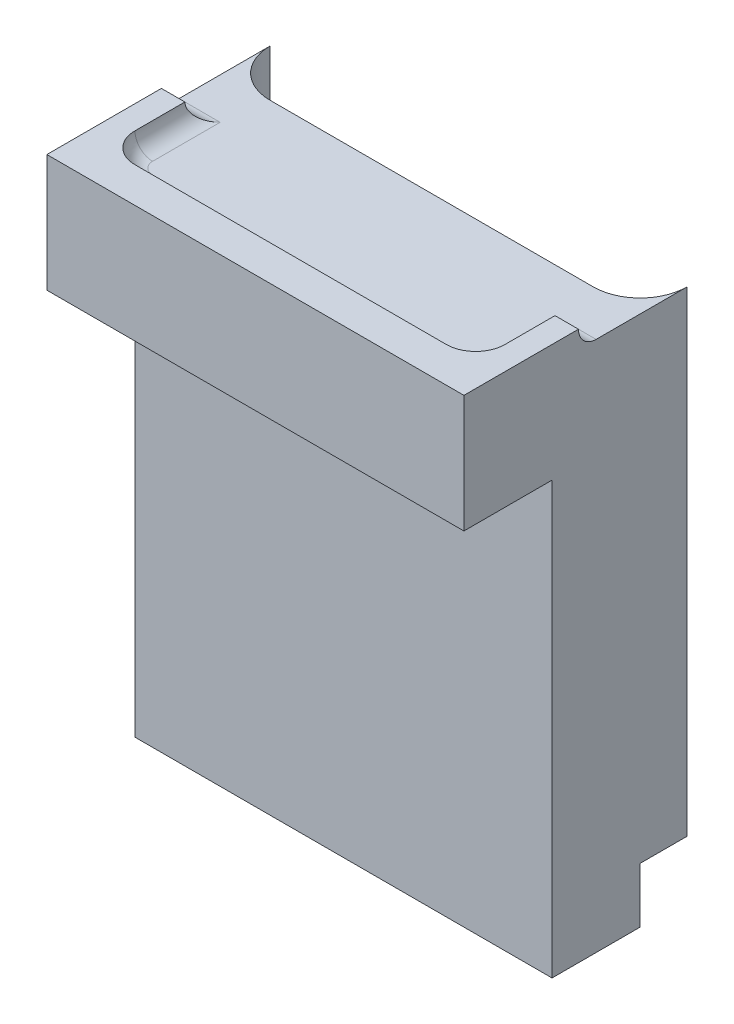
ISO-10303-21;
HEADER;
FILE_DESCRIPTION(('STEP AP214'),'2;1');
FILE_NAME('part.step','',(''),(''),'','','');
FILE_SCHEMA(('AUTOMOTIVE_DESIGN { 1 0 10303 214 1 1 1 1 }'));
ENDSEC;
DATA;
#1=APPLICATION_CONTEXT('core data for automotive mechanical design processes');
#2=APPLICATION_PROTOCOL_DEFINITION('international standard','automotive_design',2000,#1);
#3=PRODUCT_CONTEXT('',#1,'mechanical');
#4=PRODUCT('Part','Part','',(#3));
#5=PRODUCT_RELATED_PRODUCT_CATEGORY('part','',(#4));
#6=PRODUCT_DEFINITION_FORMATION('','',#4);
#7=PRODUCT_DEFINITION_CONTEXT('part definition',#1,'design');
#8=PRODUCT_DEFINITION('design','',#6,#7);
#9=PRODUCT_DEFINITION_SHAPE('','',#8);
#10=(LENGTH_UNIT() NAMED_UNIT(*) SI_UNIT(.MILLI.,.METRE.));
#11=(NAMED_UNIT(*) PLANE_ANGLE_UNIT() SI_UNIT($,.RADIAN.));
#12=(NAMED_UNIT(*) SI_UNIT($,.STERADIAN.) SOLID_ANGLE_UNIT());
#13=UNCERTAINTY_MEASURE_WITH_UNIT(LENGTH_MEASURE(1.E-05),#10,'distance_accuracy_value','');
#14=(GEOMETRIC_REPRESENTATION_CONTEXT(3) GLOBAL_UNCERTAINTY_ASSIGNED_CONTEXT((#13)) GLOBAL_UNIT_ASSIGNED_CONTEXT((#10,
#11,#12)) REPRESENTATION_CONTEXT('',''));
#15=CARTESIAN_POINT('',(0.,0.,0.));
#16=DIRECTION('',(0.,0.,1.));
#17=DIRECTION('',(1.,0.,0.));
#18=AXIS2_PLACEMENT_3D('',#15,#16,#17);
#19=CARTESIAN_POINT('',(-7.10000000000019,13.,4.45000000000175));
#20=DIRECTION('',(1.,0.,0.));
#21=DIRECTION('',(0.,0.,-1.));
#22=AXIS2_PLACEMENT_3D('',#19,#20,#21);
#23=PLANE('',#22);
#24=DIRECTION('',(0.,-1.,0.));
#25=VECTOR('',#24,1.);
#26=CARTESIAN_POINT('',(-7.10000000000019,25.7,9.60000000000174));
#27=LINE('',#26,#25);
#28=CARTESIAN_POINT('',(-7.10000000000019,4.6,9.60000000000174));
#29=VERTEX_POINT('',#28);
#30=CARTESIAN_POINT('',(-7.10000000000019,3.66,9.60000000000174));
#31=VERTEX_POINT('',#30);
#32=EDGE_CURVE('E182',#29,#31,#27,.T.);
#33=ORIENTED_EDGE('',*,*,#32,.T.);
#34=DIRECTION('',(0.,0.,-1.));
#35=VECTOR('',#34,1.);
#36=CARTESIAN_POINT('',(-7.10000000000019,3.66,0.));
#37=LINE('',#36,#35);
#38=CARTESIAN_POINT('',(-7.10000000000019,3.66,11.1000000000022));
#39=VERTEX_POINT('',#38);
#40=EDGE_CURVE('E217',#39,#31,#37,.T.);
#41=ORIENTED_EDGE('',*,*,#40,.F.);
#42=DIRECTION('',(0.,1.,0.));
#43=VECTOR('',#42,1.);
#44=CARTESIAN_POINT('',(-7.10000000000019,39.2564753917994,11.1000000000022));
#45=LINE('',#44,#43);
#46=CARTESIAN_POINT('',(-7.10000000000019,11.,11.1000000000022));
#47=VERTEX_POINT('',#46);
#48=EDGE_CURVE('E235',#39,#47,#45,.T.);
#49=ORIENTED_EDGE('',*,*,#48,.T.);
#50=DIRECTION('',(0.,0.,-1.));
#51=VECTOR('',#50,1.);
#52=CARTESIAN_POINT('',(-7.10000000000019,11.,0.));
#53=LINE('',#52,#51);
#54=CARTESIAN_POINT('',(-7.10000000000019,11.,12.6000000000022));
#55=VERTEX_POINT('',#54);
#56=EDGE_CURVE('E199',#55,#47,#53,.T.);
#57=ORIENTED_EDGE('',*,*,#56,.F.);
#58=DIRECTION('',(0.,-1.,0.));
#59=VECTOR('',#58,1.);
#60=CARTESIAN_POINT('',(-7.10000000000019,13.,12.6000000000022));
#61=LINE('',#60,#59);
#62=CARTESIAN_POINT('',(-7.10000000000019,13.,12.6000000000022));
#63=VERTEX_POINT('',#62);
#64=EDGE_CURVE('E212',#63,#55,#61,.T.);
#65=ORIENTED_EDGE('',*,*,#64,.F.);
#66=DIRECTION('',(0.,0.,-1.));
#67=VECTOR('',#66,1.);
#68=CARTESIAN_POINT('',(-7.10000000000019,13.,0.));
#69=LINE('',#68,#67);
#70=CARTESIAN_POINT('',(-7.10000000000019,13.,10.6500000000017));
#71=VERTEX_POINT('',#70);
#72=EDGE_CURVE('E224',#63,#71,#69,.T.);
#73=ORIENTED_EDGE('',*,*,#72,.T.);
#74=CARTESIAN_POINT('',(-7.10000000000019,13.,10.3500000000017));
#75=DIRECTION('',(1.,0.,0.));
#76=DIRECTION('',(0.,0.,-1.));
#77=AXIS2_PLACEMENT_3D('',#74,#75,#76);
#78=CIRCLE('',#77,0.3);
#79=CARTESIAN_POINT('',(-7.10000000000019,12.7,10.3500000000017));
#80=VERTEX_POINT('',#79);
#81=EDGE_CURVE('E178',#80,#71,#78,.F.);
#82=ORIENTED_EDGE('',*,*,#81,.F.);
#83=DIRECTION('',(0.,0.,-1.));
#84=VECTOR('',#83,1.);
#85=CARTESIAN_POINT('',(-7.10000000000019,12.7,4.45000000000179));
#86=LINE('',#85,#84);
#87=CARTESIAN_POINT('',(-7.09999999999805,12.7,8.80000000000174));
#88=VERTEX_POINT('',#87);
#89=EDGE_CURVE('E175',#80,#88,#86,.T.);
#90=ORIENTED_EDGE('',*,*,#89,.T.);
#91=DIRECTION('',(0.,-1.,0.));
#92=VECTOR('',#91,1.);
#93=CARTESIAN_POINT('',(-7.09999999999805,25.7,8.80000000000174));
#94=LINE('',#93,#92);
#95=CARTESIAN_POINT('',(-7.09999999999805,4.60000000000001,8.80000000000174));
#96=VERTEX_POINT('',#95);
#97=EDGE_CURVE('E167',#88,#96,#94,.T.);
#98=ORIENTED_EDGE('',*,*,#97,.T.);
#99=DIRECTION('',(0.,0.,1.));
#100=VECTOR('',#99,1.);
#101=CARTESIAN_POINT('',(-7.10000000000019,4.6,3.65000000000174));
#102=LINE('',#101,#100);
#103=EDGE_CURVE('E183',#96,#29,#102,.T.);
#104=ORIENTED_EDGE('',*,*,#103,.T.);
#105=EDGE_LOOP('',(#33,#41,#49,#57,#65,#73,#82,#90,#98,#104));
#106=FACE_BOUND('',#105,.T.);
#107=ADVANCED_FACE('F41',(#106),#23,.F.);
#108=CARTESIAN_POINT('',(1.95069654873592E-12,13.,4.45000000000175));
#109=DIRECTION('',(1.,0.,0.));
#110=DIRECTION('',(0.,0.,-1.));
#111=AXIS2_PLACEMENT_3D('',#108,#109,#110);
#112=PLANE('',#111);
#113=DIRECTION('',(0.,0.,1.));
#114=VECTOR('',#113,1.);
#115=CARTESIAN_POINT('',(1.95069654873592E-12,4.6,3.65000000000174));
#116=LINE('',#115,#114);
#117=CARTESIAN_POINT('',(1.95156391047391E-12,4.60000000000001,8.79999999999824));
#118=VERTEX_POINT('',#117);
#119=CARTESIAN_POINT('',(1.95102180938767E-12,4.6,9.59999999999824));
#120=VERTEX_POINT('',#119);
#121=EDGE_CURVE('E205',#118,#120,#116,.T.);
#122=ORIENTED_EDGE('',*,*,#121,.F.);
#123=DIRECTION('',(0.,-1.,0.));
#124=VECTOR('',#123,1.);
#125=CARTESIAN_POINT('',(1.95156391047391E-12,25.7,8.79999999999824));
#126=LINE('',#125,#124);
#127=CARTESIAN_POINT('',(1.95069654873592E-12,12.7,8.79999999999824));
#128=VERTEX_POINT('',#127);
#129=EDGE_CURVE('E196',#128,#118,#126,.T.);
#130=ORIENTED_EDGE('',*,*,#129,.F.);
#131=DIRECTION('',(0.,0.,-1.));
#132=VECTOR('',#131,1.);
#133=CARTESIAN_POINT('',(1.95069654873592E-12,12.7,4.45000000000179));
#134=LINE('',#133,#132);
#135=CARTESIAN_POINT('',(1.95129285993079E-12,12.7,10.3499999999982));
#136=VERTEX_POINT('',#135);
#137=EDGE_CURVE('E208',#136,#128,#134,.T.);
#138=ORIENTED_EDGE('',*,*,#137,.F.);
#139=CARTESIAN_POINT('',(1.9513199649851E-12,13.,10.3499999999982));
#140=DIRECTION('',(1.,0.,0.));
#141=DIRECTION('',(0.,0.,-1.));
#142=AXIS2_PLACEMENT_3D('',#139,#140,#141);
#143=CIRCLE('',#142,0.3);
#144=CARTESIAN_POINT('',(1.95129285993079E-12,13.,10.6499999999982));
#145=VERTEX_POINT('',#144);
#146=EDGE_CURVE('E232',#136,#145,#143,.F.);
#147=ORIENTED_EDGE('',*,*,#146,.T.);
#148=DIRECTION('',(0.,0.,-1.));
#149=VECTOR('',#148,1.);
#150=CARTESIAN_POINT('',(1.9502229585845E-12,13.,0.));
#151=LINE('',#150,#149);
#152=CARTESIAN_POINT('',(1.94982918699793E-12,13.,12.6000000000022));
#153=VERTEX_POINT('',#152);
#154=EDGE_CURVE('E214',#153,#145,#151,.T.);
#155=ORIENTED_EDGE('',*,*,#154,.F.);
#156=DIRECTION('',(0.,-1.,0.));
#157=VECTOR('',#156,1.);
#158=CARTESIAN_POINT('',(1.94982918699793E-12,13.,12.6000000000022));
#159=LINE('',#158,#157);
#160=CARTESIAN_POINT('',(1.95113022960491E-12,11.,12.6000000000022));
#161=VERTEX_POINT('',#160);
#162=EDGE_CURVE('E227',#153,#161,#159,.T.);
#163=ORIENTED_EDGE('',*,*,#162,.T.);
#164=DIRECTION('',(0.,0.,-1.));
#165=VECTOR('',#164,1.);
#166=CARTESIAN_POINT('',(1.9502229585845E-12,11.,0.));
#167=LINE('',#166,#165);
#168=CARTESIAN_POINT('',(1.95113022960491E-12,11.,11.1000000000022));
#169=VERTEX_POINT('',#168);
#170=EDGE_CURVE('E172',#161,#169,#167,.T.);
#171=ORIENTED_EDGE('',*,*,#170,.T.);
#172=DIRECTION('',(0.,1.,0.));
#173=VECTOR('',#172,1.);
#174=CARTESIAN_POINT('',(1.95156391047391E-12,39.2564753917994,11.1000000000022));
#175=LINE('',#174,#173);
#176=CARTESIAN_POINT('',(1.95156391047391E-12,3.66,11.1000000000022));
#177=VERTEX_POINT('',#176);
#178=EDGE_CURVE('E202',#177,#169,#175,.T.);
#179=ORIENTED_EDGE('',*,*,#178,.F.);
#180=DIRECTION('',(0.,0.,-1.));
#181=VECTOR('',#180,1.);
#182=CARTESIAN_POINT('',(1.9502229585845E-12,3.66,0.));
#183=LINE('',#182,#181);
#184=CARTESIAN_POINT('',(1.95156391047391E-12,3.66,9.59999999999824));
#185=VERTEX_POINT('',#184);
#186=EDGE_CURVE('E220',#177,#185,#183,.T.);
#187=ORIENTED_EDGE('',*,*,#186,.T.);
#188=DIRECTION('',(0.,-1.,0.));
#189=VECTOR('',#188,1.);
#190=CARTESIAN_POINT('',(1.95156391047391E-12,25.7,9.59999999999824));
#191=LINE('',#190,#189);
#192=EDGE_CURVE('E210',#120,#185,#191,.T.);
#193=ORIENTED_EDGE('',*,*,#192,.F.);
#194=EDGE_LOOP('',(#122,#130,#138,#147,#155,#163,#171,#179,#187,#193));
#195=FACE_BOUND('',#194,.T.);
#196=ADVANCED_FACE('F284',(#195),#112,.T.);
#197=CARTESIAN_POINT('',(0.,3.66,0.));
#198=DIRECTION('',(0.,1.,0.));
#199=DIRECTION('',(0.,0.,1.));
#200=AXIS2_PLACEMENT_3D('',#197,#198,#199);
#201=PLANE('',#200);
#202=DIRECTION('',(-1.,0.,0.));
#203=VECTOR('',#202,1.);
#204=CARTESIAN_POINT('',(2.45000000000471,3.66,11.1000000000022));
#205=LINE('',#204,#203);
#206=EDGE_CURVE('E49',#177,#39,#205,.T.);
#207=ORIENTED_EDGE('',*,*,#206,.T.);
#208=ORIENTED_EDGE('',*,*,#40,.T.);
#209=DIRECTION('',(1.,0.,-4.92999580553094E-13));
#210=VECTOR('',#209,1.);
#211=CARTESIAN_POINT('',(-6.29999999999765,3.66,9.60000000000135));
#212=LINE('',#211,#210);
#213=EDGE_CURVE('E260',#31,#185,#212,.T.);
#214=ORIENTED_EDGE('',*,*,#213,.T.);
#215=ORIENTED_EDGE('',*,*,#186,.F.);
#216=EDGE_LOOP('',(#207,#208,#214,#215));
#217=FACE_BOUND('',#216,.T.);
#218=ADVANCED_FACE('F269',(#217),#201,.F.);
#219=CARTESIAN_POINT('',(2.45000000000471,39.2564753917994,11.1000000000022));
#220=DIRECTION('',(0.,0.,1.));
#221=DIRECTION('',(1.,0.,0.));
#222=AXIS2_PLACEMENT_3D('',#219,#220,#221);
#223=PLANE('',#222);
#224=ORIENTED_EDGE('',*,*,#48,.F.);
#225=ORIENTED_EDGE('',*,*,#206,.F.);
#226=ORIENTED_EDGE('',*,*,#178,.T.);
#227=DIRECTION('',(-1.,0.,0.));
#228=VECTOR('',#227,1.);
#229=CARTESIAN_POINT('',(2.45000000000471,11.,11.1000000000022));
#230=LINE('',#229,#228);
#231=EDGE_CURVE('E263',#169,#47,#230,.T.);
#232=ORIENTED_EDGE('',*,*,#231,.T.);
#233=EDGE_LOOP('',(#224,#225,#226,#232));
#234=FACE_BOUND('',#233,.T.);
#235=ADVANCED_FACE('F273',(#234),#223,.T.);
#236=CARTESIAN_POINT('',(0.,11.,0.));
#237=DIRECTION('',(0.,1.,0.));
#238=DIRECTION('',(0.,0.,1.));
#239=AXIS2_PLACEMENT_3D('',#236,#237,#238);
#240=PLANE('',#239);
#241=DIRECTION('',(-1.,0.,0.));
#242=VECTOR('',#241,1.);
#243=CARTESIAN_POINT('',(2.95000000000471,11.,12.6000000000022));
#244=LINE('',#243,#242);
#245=EDGE_CURVE('E11',#161,#55,#244,.T.);
#246=ORIENTED_EDGE('',*,*,#245,.T.);
#247=ORIENTED_EDGE('',*,*,#56,.T.);
#248=ORIENTED_EDGE('',*,*,#231,.F.);
#249=ORIENTED_EDGE('',*,*,#170,.F.);
#250=EDGE_LOOP('',(#246,#247,#248,#249));
#251=FACE_BOUND('',#250,.T.);
#252=ADVANCED_FACE('F288',(#251),#240,.F.);
#253=CARTESIAN_POINT('',(-6.29999999999765,25.7,9.60000000000135));
#254=DIRECTION('',(-4.92999580553094E-13,0.,-1.));
#255=DIRECTION('',(-1.,0.,4.92999580553094E-13));
#256=AXIS2_PLACEMENT_3D('',#253,#254,#255);
#257=PLANE('',#256);
#258=ORIENTED_EDGE('',*,*,#32,.F.);
#259=DIRECTION('',(-1.,0.,4.92841878418915E-13));
#260=VECTOR('',#259,1.);
#261=CARTESIAN_POINT('',(0.950000000002347,4.6,9.59999999999778));
#262=LINE('',#261,#260);
#263=CARTESIAN_POINT('',(-6.29999999999765,4.60000000000001,9.60000000000135));
#264=VERTEX_POINT('',#263);
#265=EDGE_CURVE('E259',#264,#29,#262,.T.);
#266=ORIENTED_EDGE('',*,*,#265,.F.);
#267=DIRECTION('',(0.,-1.,0.));
#268=VECTOR('',#267,1.);
#269=CARTESIAN_POINT('',(-6.29999999999765,25.7,9.60000000000135));
#270=LINE('',#269,#268);
#271=CARTESIAN_POINT('',(-6.29999999999765,12.7,9.60000000000135));
#272=VERTEX_POINT('',#271);
#273=EDGE_CURVE('E255',#272,#264,#270,.T.);
#274=ORIENTED_EDGE('',*,*,#273,.F.);
#275=DIRECTION('',(1.,0.,-4.92999580553094E-13));
#276=VECTOR('',#275,1.);
#277=CARTESIAN_POINT('',(-6.29999999999765,12.7,9.60000000000135));
#278=LINE('',#277,#276);
#279=CARTESIAN_POINT('',(-0.799999999997659,12.7,9.59999999999864));
#280=VERTEX_POINT('',#279);
#281=EDGE_CURVE('E63',#272,#280,#278,.T.);
#282=ORIENTED_EDGE('',*,*,#281,.T.);
#283=DIRECTION('',(0.,-1.,0.));
#284=VECTOR('',#283,1.);
#285=CARTESIAN_POINT('',(-0.799999999997659,25.7,9.59999999999864));
#286=LINE('',#285,#284);
#287=CARTESIAN_POINT('',(-0.799999999997659,4.60000000000001,9.59999999999864));
#288=VERTEX_POINT('',#287);
#289=EDGE_CURVE('E198',#280,#288,#286,.T.);
#290=ORIENTED_EDGE('',*,*,#289,.T.);
#291=EDGE_CURVE('E195',#120,#288,#262,.T.);
#292=ORIENTED_EDGE('',*,*,#291,.F.);
#293=ORIENTED_EDGE('',*,*,#192,.T.);
#294=ORIENTED_EDGE('',*,*,#213,.F.);
#295=EDGE_LOOP('',(#258,#266,#274,#282,#290,#292,#293,#294));
#296=FACE_BOUND('',#295,.T.);
#297=ADVANCED_FACE('F280',(#296),#257,.T.);
#298=CARTESIAN_POINT('',(-0.799999999998049,25.7,8.79999999999864));
#299=DIRECTION('',(0.,-1.,0.));
#300=DIRECTION('',(4.92841878418915E-13,0.,1.));
#301=AXIS2_PLACEMENT_3D('',#298,#299,#300);
#302=CYLINDRICAL_SURFACE('',#301,0.8);
#303=CARTESIAN_POINT('',(-0.799999999998049,4.6,8.79999999999864));
#304=DIRECTION('',(0.,-1.,0.));
#305=DIRECTION('',(4.92841878418915E-13,0.,1.));
#306=AXIS2_PLACEMENT_3D('',#303,#304,#305);
#307=CIRCLE('',#306,0.8);
#308=EDGE_CURVE('E186',#118,#288,#307,.T.);
#309=ORIENTED_EDGE('',*,*,#308,.T.);
#310=ORIENTED_EDGE('',*,*,#289,.F.);
#311=CARTESIAN_POINT('',(-0.799999999998049,12.7,8.79999999999864));
#312=DIRECTION('',(0.,1.,0.));
#313=DIRECTION('',(-4.92841878418915E-13,0.,-1.));
#314=AXIS2_PLACEMENT_3D('',#311,#312,#313);
#315=CIRCLE('',#314,0.8);
#316=EDGE_CURVE('E190',#280,#128,#315,.T.);
#317=ORIENTED_EDGE('',*,*,#316,.T.);
#318=ORIENTED_EDGE('',*,*,#129,.T.);
#319=EDGE_LOOP('',(#309,#310,#317,#318));
#320=FACE_BOUND('',#319,.T.);
#321=ADVANCED_FACE('F343',(#320),#302,.F.);
#322=CARTESIAN_POINT('',(-7.10000000000059,4.6,3.65000000000174));
#323=DIRECTION('',(0.,-1.,0.));
#324=DIRECTION('',(4.92841878418915E-13,0.,1.));
#325=AXIS2_PLACEMENT_3D('',#322,#323,#324);
#326=PLANE('',#325);
#327=ORIENTED_EDGE('',*,*,#308,.F.);
#328=ORIENTED_EDGE('',*,*,#121,.T.);
#329=ORIENTED_EDGE('',*,*,#291,.T.);
#330=EDGE_LOOP('',(#327,#328,#329));
#331=FACE_BOUND('',#330,.T.);
#332=ADVANCED_FACE('F350',(#331),#326,.T.);
#333=CARTESIAN_POINT('',(-6.29999999999805,25.7,8.80000000000135));
#334=DIRECTION('',(0.,-1.,0.));
#335=DIRECTION('',(4.92841878418915E-13,0.,1.));
#336=AXIS2_PLACEMENT_3D('',#333,#334,#335);
#337=CYLINDRICAL_SURFACE('',#336,0.8);
#338=CARTESIAN_POINT('',(-6.29999999999805,4.6,8.80000000000135));
#339=DIRECTION('',(0.,-1.,0.));
#340=DIRECTION('',(4.92841878418915E-13,0.,1.));
#341=AXIS2_PLACEMENT_3D('',#338,#339,#340);
#342=CIRCLE('',#341,0.8);
#343=EDGE_CURVE('E170',#264,#96,#342,.T.);
#344=ORIENTED_EDGE('',*,*,#343,.T.);
#345=ORIENTED_EDGE('',*,*,#97,.F.);
#346=CARTESIAN_POINT('',(-6.29999999999805,12.7,8.80000000000135));
#347=DIRECTION('',(0.,1.,0.));
#348=DIRECTION('',(-4.92841878418915E-13,0.,-1.));
#349=AXIS2_PLACEMENT_3D('',#346,#347,#348);
#350=CIRCLE('',#349,0.8);
#351=EDGE_CURVE('E56',#88,#272,#350,.T.);
#352=ORIENTED_EDGE('',*,*,#351,.T.);
#353=ORIENTED_EDGE('',*,*,#273,.T.);
#354=EDGE_LOOP('',(#344,#345,#352,#353));
#355=FACE_BOUND('',#354,.T.);
#356=ADVANCED_FACE('F169',(#355),#337,.F.);
#357=ORIENTED_EDGE('',*,*,#103,.F.);
#358=ORIENTED_EDGE('',*,*,#343,.F.);
#359=ORIENTED_EDGE('',*,*,#265,.T.);
#360=EDGE_LOOP('',(#357,#358,#359));
#361=FACE_BOUND('',#360,.T.);
#362=ADVANCED_FACE('F353',(#361),#326,.T.);
#363=CARTESIAN_POINT('',(-0.899999999996717,13.,11.4999999999987));
#364=DIRECTION('',(0.,1.,0.));
#365=DIRECTION('',(-4.92841878418915E-13,0.,-1.));
#366=AXIS2_PLACEMENT_3D('',#363,#364,#365);
#367=DEGENERATE_TOROIDAL_SURFACE('',#366,0.2,0.3,.T.);
#368=CARTESIAN_POINT('',(-0.899999999996618,13.,11.6999999999987));
#369=DIRECTION('',(1.,0.,-4.92841878418915E-13));
#370=DIRECTION('',(-4.92841878418915E-13,0.,-1.));
#371=AXIS2_PLACEMENT_3D('',#368,#369,#370);
#372=CIRCLE('',#371,0.3);
#373=CARTESIAN_POINT('',(-0.899999999996471,13.,11.9999999999987));
#374=VERTEX_POINT('',#373);
#375=CARTESIAN_POINT('',(-0.899999999996618,12.7,11.6999999999987));
#376=VERTEX_POINT('',#375);
#377=EDGE_CURVE('E315',#374,#376,#372,.T.);
#378=ORIENTED_EDGE('',*,*,#377,.F.);
#379=CARTESIAN_POINT('',(-0.899999999996717,13.,11.4999999999987));
#380=DIRECTION('',(0.,1.,0.));
#381=DIRECTION('',(-4.92841878418915E-13,0.,-1.));
#382=AXIS2_PLACEMENT_3D('',#379,#380,#381);
#383=CIRCLE('',#382,0.5);
#384=CARTESIAN_POINT('',(-0.399999999996717,13.,11.4999999999984));
#385=VERTEX_POINT('',#384);
#386=EDGE_CURVE('E246',#374,#385,#383,.T.);
#387=ORIENTED_EDGE('',*,*,#386,.T.);
#388=CARTESIAN_POINT('',(-0.699999999996717,13.,11.4999999999986));
#389=DIRECTION('',(-4.98624290005504E-13,0.,-1.));
#390=DIRECTION('',(-1.,0.,4.98624290005504E-13));
#391=AXIS2_PLACEMENT_3D('',#388,#389,#390);
#392=CIRCLE('',#391,0.3);
#393=CARTESIAN_POINT('',(-0.699999999996717,12.7,11.4999999999986));
#394=VERTEX_POINT('',#393);
#395=EDGE_CURVE('E318',#385,#394,#392,.T.);
#396=ORIENTED_EDGE('',*,*,#395,.T.);
#397=CARTESIAN_POINT('',(-0.899999999996717,12.7,11.4999999999987));
#398=DIRECTION('',(0.,1.,0.));
#399=DIRECTION('',(-4.92841878418915E-13,0.,-1.));
#400=AXIS2_PLACEMENT_3D('',#397,#398,#399);
#401=CIRCLE('',#400,0.2);
#402=EDGE_CURVE('E336',#394,#376,#401,.F.);
#403=ORIENTED_EDGE('',*,*,#402,.T.);
#404=EDGE_LOOP('',(#378,#387,#396,#403));
#405=FACE_BOUND('',#404,.T.);
#406=ADVANCED_FACE('F363',(#405),#367,.F.);
#407=CARTESIAN_POINT('',(-0.899999999996622,13.,11.6999999999987));
#408=DIRECTION('',(-1.,0.,4.92841878418915E-13));
#409=DIRECTION('',(4.92841878418915E-13,0.,1.));
#410=AXIS2_PLACEMENT_3D('',#407,#408,#409);
#411=CYLINDRICAL_SURFACE('',#410,0.3);
#412=CARTESIAN_POINT('',(-6.19999999999662,13.,11.7000000000013));
#413=DIRECTION('',(1.,0.,-5.00069892902151E-13));
#414=DIRECTION('',(-5.00069892902151E-13,0.,-1.));
#415=AXIS2_PLACEMENT_3D('',#412,#413,#414);
#416=CIRCLE('',#415,0.3);
#417=CARTESIAN_POINT('',(-6.19999999999647,13.,12.0000000000013));
#418=VERTEX_POINT('',#417);
#419=CARTESIAN_POINT('',(-6.19999999999662,12.7,11.7000000000013));
#420=VERTEX_POINT('',#419);
#421=EDGE_CURVE('E310',#418,#420,#416,.T.);
#422=ORIENTED_EDGE('',*,*,#421,.F.);
#423=DIRECTION('',(1.,0.,-4.92841878418915E-13));
#424=VECTOR('',#423,1.);
#425=CARTESIAN_POINT('',(-0.899999999996471,13.,11.9999999999987));
#426=LINE('',#425,#424);
#427=EDGE_CURVE('E243',#418,#374,#426,.T.);
#428=ORIENTED_EDGE('',*,*,#427,.T.);
#429=ORIENTED_EDGE('',*,*,#377,.T.);
#430=DIRECTION('',(1.,0.,-4.92841878418915E-13));
#431=VECTOR('',#430,1.);
#432=CARTESIAN_POINT('',(-6.19999999999661,12.7,11.7000000000013));
#433=LINE('',#432,#431);
#434=EDGE_CURVE('E256',#376,#420,#433,.F.);
#435=ORIENTED_EDGE('',*,*,#434,.T.);
#436=EDGE_LOOP('',(#422,#428,#429,#435));
#437=FACE_BOUND('',#436,.T.);
#438=ADVANCED_FACE('F416',(#437),#411,.F.);
#439=CARTESIAN_POINT('',(-6.19999999999672,13.,11.5000000000013));
#440=DIRECTION('',(0.,1.,0.));
#441=DIRECTION('',(-4.92841878418915E-13,0.,-1.));
#442=AXIS2_PLACEMENT_3D('',#439,#440,#441);
#443=DEGENERATE_TOROIDAL_SURFACE('',#442,0.2,0.3,.T.);
#444=CARTESIAN_POINT('',(-6.39999999999672,13.,11.5000000000014));
#445=DIRECTION('',(4.92841878418915E-13,0.,1.));
#446=DIRECTION('',(1.,0.,-4.92841878418915E-13));
#447=AXIS2_PLACEMENT_3D('',#444,#445,#446);
#448=CIRCLE('',#447,0.3);
#449=CARTESIAN_POINT('',(-6.69999999999672,13.,11.5000000000015));
#450=VERTEX_POINT('',#449);
#451=CARTESIAN_POINT('',(-6.39999999999672,12.7,11.5000000000014));
#452=VERTEX_POINT('',#451);
#453=EDGE_CURVE('E308',#450,#452,#448,.T.);
#454=ORIENTED_EDGE('',*,*,#453,.F.);
#455=CARTESIAN_POINT('',(-6.19999999999672,13.,11.5000000000013));
#456=DIRECTION('',(0.,1.,0.));
#457=DIRECTION('',(-4.92841878418915E-13,0.,-1.));
#458=AXIS2_PLACEMENT_3D('',#455,#456,#457);
#459=CIRCLE('',#458,0.5);
#460=EDGE_CURVE('E328',#450,#418,#459,.T.);
#461=ORIENTED_EDGE('',*,*,#460,.T.);
#462=ORIENTED_EDGE('',*,*,#421,.T.);
#463=CARTESIAN_POINT('',(-6.19999999999672,12.7,11.5000000000013));
#464=DIRECTION('',(0.,1.,0.));
#465=DIRECTION('',(-4.92841878418915E-13,0.,-1.));
#466=AXIS2_PLACEMENT_3D('',#463,#464,#465);
#467=CIRCLE('',#466,0.2);
#468=EDGE_CURVE('E332',#420,#452,#467,.F.);
#469=ORIENTED_EDGE('',*,*,#468,.T.);
#470=EDGE_LOOP('',(#454,#461,#462,#469));
#471=FACE_BOUND('',#470,.T.);
#472=ADVANCED_FACE('F427',(#471),#443,.F.);
#473=CARTESIAN_POINT('',(-6.39999999999714,13.,10.6500000000014));
#474=DIRECTION('',(-4.92841878418915E-13,0.,-1.));
#475=DIRECTION('',(-1.,0.,4.92841878418915E-13));
#476=AXIS2_PLACEMENT_3D('',#473,#474,#475);
#477=CYLINDRICAL_SURFACE('',#476,0.3);
#478=CARTESIAN_POINT('',(-6.39999999999728,13.,10.3500000000014));
#479=DIRECTION('',(-0.707106781186896,0.,-0.707106781186199));
#480=DIRECTION('',(0.707106781186199,0.,-0.707106781186896));
#481=AXIS2_PLACEMENT_3D('',#478,#479,#480);
#482=ELLIPSE('',#481,0.424264068711928,0.3);
#483=CARTESIAN_POINT('',(-6.69999999999714,13.,10.6500000000015));
#484=VERTEX_POINT('',#483);
#485=CARTESIAN_POINT('',(-6.39999999999728,12.7,10.3500000000014));
#486=VERTEX_POINT('',#485);
#487=EDGE_CURVE('E302',#484,#486,#482,.F.);
#488=ORIENTED_EDGE('',*,*,#487,.F.);
#489=DIRECTION('',(4.92841878418915E-13,0.,1.));
#490=VECTOR('',#489,1.);
#491=CARTESIAN_POINT('',(-6.69999999999672,13.,11.5000000000015));
#492=LINE('',#491,#490);
#493=EDGE_CURVE('E250',#484,#450,#492,.T.);
#494=ORIENTED_EDGE('',*,*,#493,.T.);
#495=ORIENTED_EDGE('',*,*,#453,.T.);
#496=DIRECTION('',(4.92841878418915E-13,0.,1.));
#497=VECTOR('',#496,1.);
#498=CARTESIAN_POINT('',(-6.39999999999714,12.7,10.6500000000014));
#499=LINE('',#498,#497);
#500=EDGE_CURVE('E252',#452,#486,#499,.F.);
#501=ORIENTED_EDGE('',*,*,#500,.T.);
#502=EDGE_LOOP('',(#488,#494,#495,#501));
#503=FACE_BOUND('',#502,.T.);
#504=ADVANCED_FACE('F304',(#503),#477,.F.);
#505=CARTESIAN_POINT('',(0.,13.,0.));
#506=DIRECTION('',(0.,1.,0.));
#507=DIRECTION('',(0.,0.,1.));
#508=AXIS2_PLACEMENT_3D('',#505,#506,#507);
#509=PLANE('',#508);
#510=ORIENTED_EDGE('',*,*,#72,.F.);
#511=DIRECTION('',(1.,0.,0.));
#512=VECTOR('',#511,1.);
#513=CARTESIAN_POINT('',(-11.0499999999977,13.,12.6000000000022));
#514=LINE('',#513,#512);
#515=EDGE_CURVE('E201',#63,#153,#514,.T.);
#516=ORIENTED_EDGE('',*,*,#515,.T.);
#517=ORIENTED_EDGE('',*,*,#154,.T.);
#518=DIRECTION('',(1.,0.,-4.92841878418915E-13));
#519=VECTOR('',#518,1.);
#520=CARTESIAN_POINT('',(0.10000000000286,13.,10.6499999999982));
#521=LINE('',#520,#519);
#522=CARTESIAN_POINT('',(-0.399999999997135,13.,10.6499999999984));
#523=VERTEX_POINT('',#522);
#524=EDGE_CURVE('E253',#523,#145,#521,.T.);
#525=ORIENTED_EDGE('',*,*,#524,.F.);
#526=DIRECTION('',(-4.92841878418915E-13,0.,-1.));
#527=VECTOR('',#526,1.);
#528=CARTESIAN_POINT('',(-0.399999999997136,13.,10.6499999999984));
#529=LINE('',#528,#527);
#530=EDGE_CURVE('E325',#385,#523,#529,.T.);
#531=ORIENTED_EDGE('',*,*,#530,.F.);
#532=ORIENTED_EDGE('',*,*,#386,.F.);
#533=ORIENTED_EDGE('',*,*,#427,.F.);
#534=ORIENTED_EDGE('',*,*,#460,.F.);
#535=ORIENTED_EDGE('',*,*,#493,.F.);
#536=DIRECTION('',(1.,0.,-4.92841878418915E-13));
#537=VECTOR('',#536,1.);
#538=CARTESIAN_POINT('',(-6.69999999999714,13.,10.6500000000015));
#539=LINE('',#538,#537);
#540=EDGE_CURVE('E244',#71,#484,#539,.T.);
#541=ORIENTED_EDGE('',*,*,#540,.F.);
#542=EDGE_LOOP('',(#510,#516,#517,#525,#531,#532,#533,#534,#535,#541));
#543=FACE_BOUND('',#542,.T.);
#544=ADVANCED_FACE('F295',(#543),#509,.T.);
#545=CARTESIAN_POINT('',(-0.699999999997136,13.,10.6499999999986));
#546=DIRECTION('',(4.92841878418915E-13,0.,1.));
#547=DIRECTION('',(1.,0.,-4.92841878418915E-13));
#548=AXIS2_PLACEMENT_3D('',#545,#546,#547);
#549=CYLINDRICAL_SURFACE('',#548,0.3);
#550=ORIENTED_EDGE('',*,*,#395,.F.);
#551=ORIENTED_EDGE('',*,*,#530,.T.);
#552=CARTESIAN_POINT('',(-0.699999999997284,13.,10.3499999999986));
#553=DIRECTION('',(-0.707106781186199,0.,0.707106781186896));
#554=DIRECTION('',(-0.707106781186896,0.,-0.707106781186199));
#555=AXIS2_PLACEMENT_3D('',#552,#553,#554);
#556=ELLIPSE('',#555,0.424264068711928,0.3);
#557=CARTESIAN_POINT('',(-0.699999999997284,12.7,10.3499999999986));
#558=VERTEX_POINT('',#557);
#559=EDGE_CURVE('E264',#523,#558,#556,.F.);
#560=ORIENTED_EDGE('',*,*,#559,.T.);
#561=DIRECTION('',(-4.92841878418915E-13,0.,-1.));
#562=VECTOR('',#561,1.);
#563=CARTESIAN_POINT('',(-0.699999999996717,12.7,11.4999999999986));
#564=LINE('',#563,#562);
#565=EDGE_CURVE('E334',#558,#394,#564,.F.);
#566=ORIENTED_EDGE('',*,*,#565,.T.);
#567=EDGE_LOOP('',(#550,#551,#560,#566));
#568=FACE_BOUND('',#567,.T.);
#569=ADVANCED_FACE('F454',(#568),#549,.F.);
#570=CARTESIAN_POINT('',(-7.20000000000019,12.7,4.45000000000179));
#571=DIRECTION('',(0.,1.,0.));
#572=DIRECTION('',(-4.92841878418915E-13,0.,-1.));
#573=AXIS2_PLACEMENT_3D('',#570,#571,#572);
#574=PLANE('',#573);
#575=ORIENTED_EDGE('',*,*,#89,.F.);
#576=DIRECTION('',(1.,0.,-4.92841878418915E-13));
#577=VECTOR('',#576,1.);
#578=CARTESIAN_POINT('',(-7.19999999999728,12.7,10.3500000000018));
#579=LINE('',#578,#577);
#580=EDGE_CURVE('E247',#486,#80,#579,.F.);
#581=ORIENTED_EDGE('',*,*,#580,.F.);
#582=ORIENTED_EDGE('',*,*,#500,.F.);
#583=ORIENTED_EDGE('',*,*,#468,.F.);
#584=ORIENTED_EDGE('',*,*,#434,.F.);
#585=ORIENTED_EDGE('',*,*,#402,.F.);
#586=ORIENTED_EDGE('',*,*,#565,.F.);
#587=DIRECTION('',(1.,0.,-4.92841878418915E-13));
#588=VECTOR('',#587,1.);
#589=CARTESIAN_POINT('',(-0.399999999997284,12.7,10.3499999999984));
#590=LINE('',#589,#588);
#591=EDGE_CURVE('E249',#136,#558,#590,.F.);
#592=ORIENTED_EDGE('',*,*,#591,.F.);
#593=ORIENTED_EDGE('',*,*,#137,.T.);
#594=ORIENTED_EDGE('',*,*,#316,.F.);
#595=ORIENTED_EDGE('',*,*,#281,.F.);
#596=ORIENTED_EDGE('',*,*,#351,.F.);
#597=EDGE_LOOP('',(#575,#581,#582,#583,#584,#585,#586,#592,#593,#594,#595,#596));
#598=FACE_BOUND('',#597,.T.);
#599=ADVANCED_FACE('F185',(#598),#574,.T.);
#600=CARTESIAN_POINT('',(0.100000000002713,13.,10.3499999999982));
#601=DIRECTION('',(-1.,0.,4.92841878418915E-13));
#602=DIRECTION('',(4.92841878418915E-13,0.,1.));
#603=AXIS2_PLACEMENT_3D('',#600,#601,#602);
#604=CYLINDRICAL_SURFACE('',#603,0.3);
#605=ORIENTED_EDGE('',*,*,#146,.F.);
#606=ORIENTED_EDGE('',*,*,#591,.T.);
#607=ORIENTED_EDGE('',*,*,#559,.F.);
#608=ORIENTED_EDGE('',*,*,#524,.T.);
#609=EDGE_LOOP('',(#605,#606,#607,#608));
#610=FACE_BOUND('',#609,.T.);
#611=ADVANCED_FACE('F471',(#610),#604,.F.);
#612=CARTESIAN_POINT('',(-6.69999999999728,13.,10.3500000000015));
#613=DIRECTION('',(-1.,0.,4.92841878418915E-13));
#614=DIRECTION('',(4.92841878418915E-13,0.,1.));
#615=AXIS2_PLACEMENT_3D('',#612,#613,#614);
#616=CYLINDRICAL_SURFACE('',#615,0.3);
#617=ORIENTED_EDGE('',*,*,#580,.T.);
#618=ORIENTED_EDGE('',*,*,#81,.T.);
#619=ORIENTED_EDGE('',*,*,#540,.T.);
#620=ORIENTED_EDGE('',*,*,#487,.T.);
#621=EDGE_LOOP('',(#617,#618,#619,#620));
#622=FACE_BOUND('',#621,.T.);
#623=ADVANCED_FACE('F43',(#622),#616,.F.);
#624=CARTESIAN_POINT('',(-11.0499999999977,13.,12.6000000000022));
#625=DIRECTION('',(0.,0.,-1.));
#626=DIRECTION('',(-1.,0.,0.));
#627=AXIS2_PLACEMENT_3D('',#624,#625,#626);
#628=PLANE('',#627);
#629=ORIENTED_EDGE('',*,*,#515,.F.);
#630=ORIENTED_EDGE('',*,*,#64,.T.);
#631=ORIENTED_EDGE('',*,*,#245,.F.);
#632=ORIENTED_EDGE('',*,*,#162,.F.);
#633=EDGE_LOOP('',(#629,#630,#631,#632));
#634=FACE_BOUND('',#633,.T.);
#635=ADVANCED_FACE('F293',(#634),#628,.F.);
#636=CLOSED_SHELL('',(#107,#196,#218,#235,#252,#297,#321,#332,#356,#362,#406,#438,#472,#504,
#544,#569,#599,#611,#623,#635));
#637=MANIFOLD_SOLID_BREP('B2',#636);
#638=ADVANCED_BREP_SHAPE_REPRESENTATION('',(#18,#637),#14);
#639=SHAPE_DEFINITION_REPRESENTATION(#9,#638);
ENDSEC;
END-ISO-10303-21;
